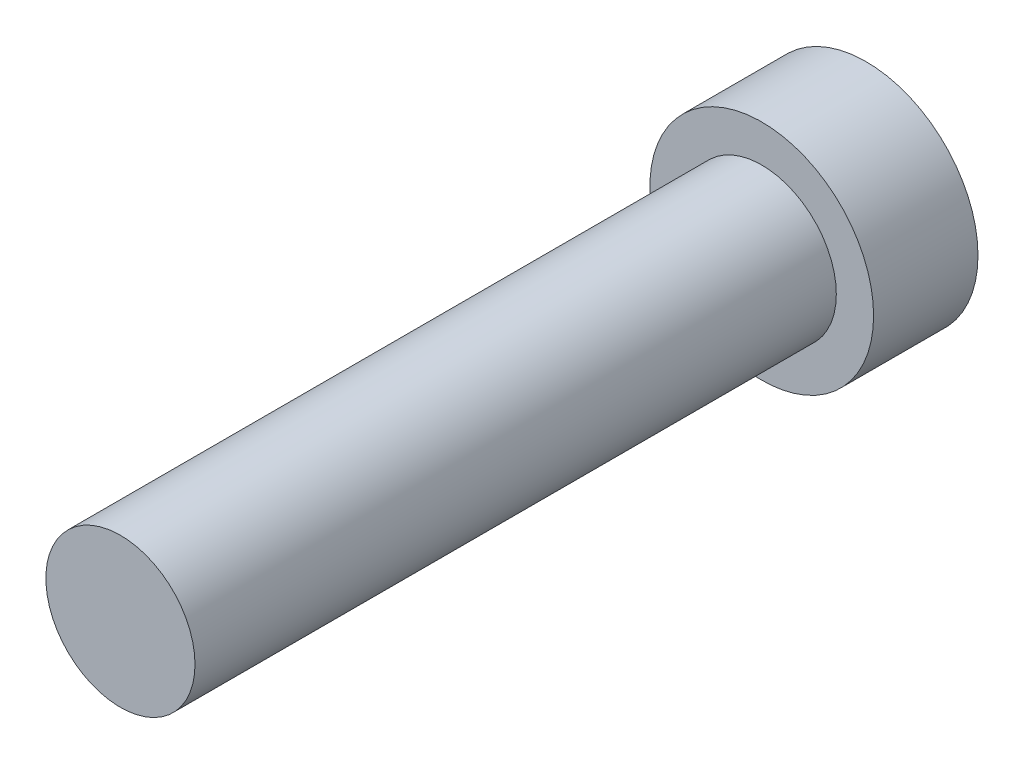
ISO-10303-21;
HEADER;
FILE_DESCRIPTION(('STEP AP214'),'2;1');
FILE_NAME('part.step','',(''),(''),'','','');
FILE_SCHEMA(('AUTOMOTIVE_DESIGN { 1 0 10303 214 1 1 1 1 }'));
ENDSEC;
DATA;
#1=APPLICATION_CONTEXT('core data for automotive mechanical design processes');
#2=APPLICATION_PROTOCOL_DEFINITION('international standard','automotive_design',2000,#1);
#3=PRODUCT_CONTEXT('',#1,'mechanical');
#4=PRODUCT('Part','Part','',(#3));
#5=PRODUCT_RELATED_PRODUCT_CATEGORY('part','',(#4));
#6=PRODUCT_DEFINITION_FORMATION('','',#4);
#7=PRODUCT_DEFINITION_CONTEXT('part definition',#1,'design');
#8=PRODUCT_DEFINITION('design','',#6,#7);
#9=PRODUCT_DEFINITION_SHAPE('','',#8);
#10=(LENGTH_UNIT() NAMED_UNIT(*) SI_UNIT(.MILLI.,.METRE.));
#11=(NAMED_UNIT(*) PLANE_ANGLE_UNIT() SI_UNIT($,.RADIAN.));
#12=(NAMED_UNIT(*) SI_UNIT($,.STERADIAN.) SOLID_ANGLE_UNIT());
#13=UNCERTAINTY_MEASURE_WITH_UNIT(LENGTH_MEASURE(1.E-05),#10,'distance_accuracy_value','');
#14=(GEOMETRIC_REPRESENTATION_CONTEXT(3) GLOBAL_UNCERTAINTY_ASSIGNED_CONTEXT((#13)) GLOBAL_UNIT_ASSIGNED_CONTEXT((#10,
#11,#12)) REPRESENTATION_CONTEXT('',''));
#15=CARTESIAN_POINT('',(0.,0.,0.));
#16=DIRECTION('',(0.,0.,1.));
#17=DIRECTION('',(1.,0.,0.));
#18=AXIS2_PLACEMENT_3D('',#15,#16,#17);
#19=CARTESIAN_POINT('',(0.,0.,7.));
#20=DIRECTION('',(0.,0.,-1.));
#21=DIRECTION('',(-1.,0.,0.));
#22=AXIS2_PLACEMENT_3D('',#19,#20,#21);
#23=CYLINDRICAL_SURFACE('',#22,7.5);
#24=CARTESIAN_POINT('',(0.,0.,7.));
#25=DIRECTION('',(0.,0.,1.));
#26=DIRECTION('',(1.,0.,0.));
#27=AXIS2_PLACEMENT_3D('',#24,#25,#26);
#28=CIRCLE('',#27,7.5);
#29=CARTESIAN_POINT('',(7.5,0.,7.));
#30=VERTEX_POINT('',#29);
#31=EDGE_CURVE('E49',#30,#30,#28,.T.);
#32=ORIENTED_EDGE('',*,*,#31,.F.);
#33=EDGE_LOOP('',(#32));
#34=FACE_BOUND('',#33,.T.);
#35=CARTESIAN_POINT('',(0.,0.,0.));
#36=DIRECTION('',(0.,0.,1.));
#37=DIRECTION('',(1.,0.,0.));
#38=AXIS2_PLACEMENT_3D('',#35,#36,#37);
#39=CIRCLE('',#38,7.5);
#40=CARTESIAN_POINT('',(7.5,0.,0.));
#41=VERTEX_POINT('',#40);
#42=EDGE_CURVE('E44',#41,#41,#39,.T.);
#43=ORIENTED_EDGE('',*,*,#42,.T.);
#44=EDGE_LOOP('',(#43));
#45=FACE_BOUND('',#44,.T.);
#46=ADVANCED_FACE('F41',(#34,#45),#23,.T.);
#47=CARTESIAN_POINT('',(0.,0.,7.));
#48=DIRECTION('',(0.,0.,1.));
#49=DIRECTION('',(1.,0.,0.));
#50=AXIS2_PLACEMENT_3D('',#47,#48,#49);
#51=PLANE('',#50);
#52=CARTESIAN_POINT('',(0.,0.,7.));
#53=DIRECTION('',(0.,0.,1.));
#54=DIRECTION('',(1.,0.,0.));
#55=AXIS2_PLACEMENT_3D('',#52,#53,#54);
#56=CIRCLE('',#55,5.);
#57=CARTESIAN_POINT('',(5.,0.,7.));
#58=VERTEX_POINT('',#57);
#59=EDGE_CURVE('E10',#58,#58,#56,.T.);
#60=ORIENTED_EDGE('',*,*,#59,.F.);
#61=EDGE_LOOP('',(#60));
#62=FACE_BOUND('',#61,.T.);
#63=ORIENTED_EDGE('',*,*,#31,.T.);
#64=EDGE_LOOP('',(#63));
#65=FACE_BOUND('',#64,.T.);
#66=ADVANCED_FACE('F69',(#62,#65),#51,.T.);
#67=CARTESIAN_POINT('',(0.,0.,0.));
#68=DIRECTION('',(0.,0.,1.));
#69=DIRECTION('',(1.,0.,0.));
#70=AXIS2_PLACEMENT_3D('',#67,#68,#69);
#71=PLANE('',#70);
#72=ORIENTED_EDGE('',*,*,#42,.F.);
#73=EDGE_LOOP('',(#72));
#74=FACE_BOUND('',#73,.T.);
#75=ADVANCED_FACE('F66',(#74),#71,.F.);
#76=CARTESIAN_POINT('',(0.,0.,50.));
#77=DIRECTION('',(0.,0.,-1.));
#78=DIRECTION('',(-1.,0.,0.));
#79=AXIS2_PLACEMENT_3D('',#76,#77,#78);
#80=CYLINDRICAL_SURFACE('',#79,5.);
#81=CARTESIAN_POINT('',(0.,0.,50.));
#82=DIRECTION('',(0.,0.,1.));
#83=DIRECTION('',(1.,0.,0.));
#84=AXIS2_PLACEMENT_3D('',#81,#82,#83);
#85=CIRCLE('',#84,5.);
#86=CARTESIAN_POINT('',(5.,0.,50.));
#87=VERTEX_POINT('',#86);
#88=EDGE_CURVE('E56',#87,#87,#85,.T.);
#89=ORIENTED_EDGE('',*,*,#88,.F.);
#90=EDGE_LOOP('',(#89));
#91=FACE_BOUND('',#90,.T.);
#92=ORIENTED_EDGE('',*,*,#59,.T.);
#93=EDGE_LOOP('',(#92));
#94=FACE_BOUND('',#93,.T.);
#95=ADVANCED_FACE('F68',(#91,#94),#80,.T.);
#96=CARTESIAN_POINT('',(0.,0.,50.));
#97=DIRECTION('',(0.,0.,1.));
#98=DIRECTION('',(1.,0.,0.));
#99=AXIS2_PLACEMENT_3D('',#96,#97,#98);
#100=PLANE('',#99);
#101=ORIENTED_EDGE('',*,*,#88,.T.);
#102=EDGE_LOOP('',(#101));
#103=FACE_BOUND('',#102,.T.);
#104=ADVANCED_FACE('F74',(#103),#100,.T.);
#105=CLOSED_SHELL('',(#46,#66,#75,#95,#104));
#106=MANIFOLD_SOLID_BREP('B2',#105);
#107=ADVANCED_BREP_SHAPE_REPRESENTATION('',(#18,#106),#14);
#108=SHAPE_DEFINITION_REPRESENTATION(#9,#107);
ENDSEC;
END-ISO-10303-21;
